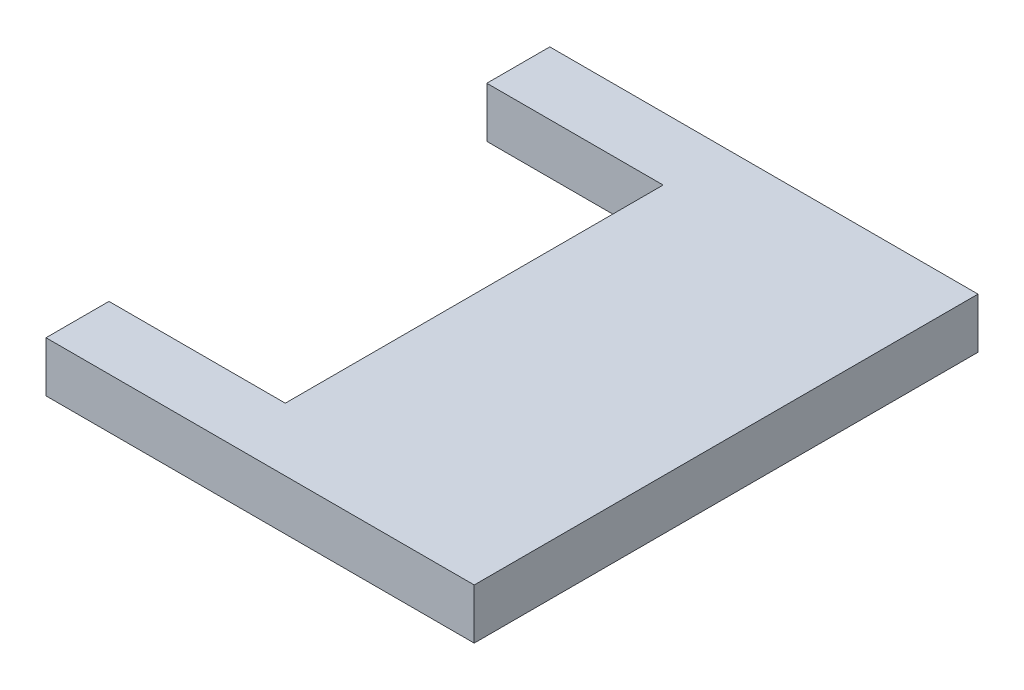
ISO-10303-21;
HEADER;
FILE_DESCRIPTION(('STEP AP214'),'2;1');
FILE_NAME('part.step','',(''),(''),'','','');
FILE_SCHEMA(('AUTOMOTIVE_DESIGN { 1 0 10303 214 1 1 1 1 }'));
ENDSEC;
DATA;
#1=APPLICATION_CONTEXT('core data for automotive mechanical design processes');
#2=APPLICATION_PROTOCOL_DEFINITION('international standard','automotive_design',2000,#1);
#3=PRODUCT_CONTEXT('',#1,'mechanical');
#4=PRODUCT('Part','Part','',(#3));
#5=PRODUCT_RELATED_PRODUCT_CATEGORY('part','',(#4));
#6=PRODUCT_DEFINITION_FORMATION('','',#4);
#7=PRODUCT_DEFINITION_CONTEXT('part definition',#1,'design');
#8=PRODUCT_DEFINITION('design','',#6,#7);
#9=PRODUCT_DEFINITION_SHAPE('','',#8);
#10=(LENGTH_UNIT() NAMED_UNIT(*) SI_UNIT(.MILLI.,.METRE.));
#11=(NAMED_UNIT(*) PLANE_ANGLE_UNIT() SI_UNIT($,.RADIAN.));
#12=(NAMED_UNIT(*) SI_UNIT($,.STERADIAN.) SOLID_ANGLE_UNIT());
#13=UNCERTAINTY_MEASURE_WITH_UNIT(LENGTH_MEASURE(1.E-05),#10,'distance_accuracy_value','');
#14=(GEOMETRIC_REPRESENTATION_CONTEXT(3) GLOBAL_UNCERTAINTY_ASSIGNED_CONTEXT((#13)) GLOBAL_UNIT_ASSIGNED_CONTEXT((#10,
#11,#12)) REPRESENTATION_CONTEXT('',''));
#15=CARTESIAN_POINT('',(0.,0.,0.));
#16=DIRECTION('',(0.,0.,1.));
#17=DIRECTION('',(1.,0.,0.));
#18=AXIS2_PLACEMENT_3D('',#15,#16,#17);
#19=CARTESIAN_POINT('',(0.,2.,0.));
#20=DIRECTION('',(0.,1.,0.));
#21=DIRECTION('',(0.,0.,1.));
#22=AXIS2_PLACEMENT_3D('',#19,#20,#21);
#23=PLANE('',#22);
#24=DIRECTION('',(0.,0.,-1.));
#25=VECTOR('',#24,1.);
#26=CARTESIAN_POINT('',(-2.,2.,-9.99999999999999));
#27=LINE('',#26,#25);
#28=CARTESIAN_POINT('',(-2.,2.,-7.49999999999999));
#29=VERTEX_POINT('',#28);
#30=CARTESIAN_POINT('',(-2.,2.,-9.99999999999999));
#31=VERTEX_POINT('',#30);
#32=EDGE_CURVE('E113',#29,#31,#27,.T.);
#33=ORIENTED_EDGE('',*,*,#32,.F.);
#34=DIRECTION('',(-1.,0.,0.));
#35=VECTOR('',#34,1.);
#36=CARTESIAN_POINT('',(-2.,2.,-7.49999999999999));
#37=LINE('',#36,#35);
#38=CARTESIAN_POINT('',(5.,2.,-7.49999999999999));
#39=VERTEX_POINT('',#38);
#40=EDGE_CURVE('E164',#39,#29,#37,.T.);
#41=ORIENTED_EDGE('',*,*,#40,.F.);
#42=DIRECTION('',(0.,0.,-1.));
#43=VECTOR('',#42,1.);
#44=CARTESIAN_POINT('',(5.,2.,7.50000000000001));
#45=LINE('',#44,#43);
#46=CARTESIAN_POINT('',(5.,2.,7.50000000000001));
#47=VERTEX_POINT('',#46);
#48=EDGE_CURVE('E174',#47,#39,#45,.T.);
#49=ORIENTED_EDGE('',*,*,#48,.F.);
#50=DIRECTION('',(1.,0.,0.));
#51=VECTOR('',#50,1.);
#52=CARTESIAN_POINT('',(-2.,2.,7.50000000000001));
#53=LINE('',#52,#51);
#54=CARTESIAN_POINT('',(-2.,2.,7.50000000000001));
#55=VERTEX_POINT('',#54);
#56=EDGE_CURVE('E118',#55,#47,#53,.T.);
#57=ORIENTED_EDGE('',*,*,#56,.F.);
#58=DIRECTION('',(0.,0.,-1.));
#59=VECTOR('',#58,1.);
#60=CARTESIAN_POINT('',(-2.,2.,3.18987050786824));
#61=LINE('',#60,#59);
#62=CARTESIAN_POINT('',(-2.,2.,10.));
#63=VERTEX_POINT('',#62);
#64=EDGE_CURVE('E106',#63,#55,#61,.T.);
#65=ORIENTED_EDGE('',*,*,#64,.F.);
#66=DIRECTION('',(1.,0.,0.));
#67=VECTOR('',#66,1.);
#68=CARTESIAN_POINT('',(-4.,2.,10.));
#69=LINE('',#68,#67);
#70=CARTESIAN_POINT('',(15.,2.,10.));
#71=VERTEX_POINT('',#70);
#72=EDGE_CURVE('E50',#63,#71,#69,.T.);
#73=ORIENTED_EDGE('',*,*,#72,.T.);
#74=DIRECTION('',(0.,0.,-1.));
#75=VECTOR('',#74,1.);
#76=CARTESIAN_POINT('',(15.,2.,-9.99999999999999));
#77=LINE('',#76,#75);
#78=CARTESIAN_POINT('',(15.,2.,-9.99999999999999));
#79=VERTEX_POINT('',#78);
#80=EDGE_CURVE('E128',#71,#79,#77,.T.);
#81=ORIENTED_EDGE('',*,*,#80,.T.);
#82=DIRECTION('',(-1.,0.,0.));
#83=VECTOR('',#82,1.);
#84=CARTESIAN_POINT('',(-4.,2.,-9.99999999999999));
#85=LINE('',#84,#83);
#86=EDGE_CURVE('E124',#79,#31,#85,.T.);
#87=ORIENTED_EDGE('',*,*,#86,.T.);
#88=EDGE_LOOP('',(#33,#41,#49,#57,#65,#73,#81,#87));
#89=FACE_BOUND('',#88,.T.);
#90=ADVANCED_FACE('F33',(#89),#23,.T.);
#91=CARTESIAN_POINT('',(0.,0.,0.));
#92=DIRECTION('',(0.,1.,0.));
#93=DIRECTION('',(0.,0.,1.));
#94=AXIS2_PLACEMENT_3D('',#91,#92,#93);
#95=PLANE('',#94);
#96=DIRECTION('',(-1.,0.,0.));
#97=VECTOR('',#96,1.);
#98=CARTESIAN_POINT('',(-2.,0.,-7.49999999999999));
#99=LINE('',#98,#97);
#100=CARTESIAN_POINT('',(5.,0.,-7.49999999999999));
#101=VERTEX_POINT('',#100);
#102=CARTESIAN_POINT('',(-2.,0.,-7.49999999999999));
#103=VERTEX_POINT('',#102);
#104=EDGE_CURVE('E163',#101,#103,#99,.T.);
#105=ORIENTED_EDGE('',*,*,#104,.T.);
#106=DIRECTION('',(0.,0.,-1.));
#107=VECTOR('',#106,1.);
#108=CARTESIAN_POINT('',(-2.,0.,0.));
#109=LINE('',#108,#107);
#110=CARTESIAN_POINT('',(-2.,0.,-9.99999999999999));
#111=VERTEX_POINT('',#110);
#112=EDGE_CURVE('E70',#103,#111,#109,.T.);
#113=ORIENTED_EDGE('',*,*,#112,.T.);
#114=DIRECTION('',(-1.,0.,0.));
#115=VECTOR('',#114,1.);
#116=CARTESIAN_POINT('',(-4.,0.,-9.99999999999999));
#117=LINE('',#116,#115);
#118=CARTESIAN_POINT('',(15.,0.,-9.99999999999999));
#119=VERTEX_POINT('',#118);
#120=EDGE_CURVE('E62',#119,#111,#117,.T.);
#121=ORIENTED_EDGE('',*,*,#120,.F.);
#122=DIRECTION('',(0.,0.,-1.));
#123=VECTOR('',#122,1.);
#124=CARTESIAN_POINT('',(15.,0.,-9.99999999999999));
#125=LINE('',#124,#123);
#126=CARTESIAN_POINT('',(15.,0.,10.));
#127=VERTEX_POINT('',#126);
#128=EDGE_CURVE('E132',#127,#119,#125,.T.);
#129=ORIENTED_EDGE('',*,*,#128,.F.);
#130=DIRECTION('',(1.,0.,0.));
#131=VECTOR('',#130,1.);
#132=CARTESIAN_POINT('',(-4.,0.,10.));
#133=LINE('',#132,#131);
#134=CARTESIAN_POINT('',(-2.,0.,10.));
#135=VERTEX_POINT('',#134);
#136=EDGE_CURVE('E137',#135,#127,#133,.T.);
#137=ORIENTED_EDGE('',*,*,#136,.F.);
#138=DIRECTION('',(0.,0.,-1.));
#139=VECTOR('',#138,1.);
#140=CARTESIAN_POINT('',(-2.,0.,0.));
#141=LINE('',#140,#139);
#142=CARTESIAN_POINT('',(-2.,0.,7.50000000000001));
#143=VERTEX_POINT('',#142);
#144=EDGE_CURVE('E109',#135,#143,#141,.T.);
#145=ORIENTED_EDGE('',*,*,#144,.T.);
#146=DIRECTION('',(1.,0.,0.));
#147=VECTOR('',#146,1.);
#148=CARTESIAN_POINT('',(-2.,0.,7.50000000000001));
#149=LINE('',#148,#147);
#150=CARTESIAN_POINT('',(5.,0.,7.50000000000001));
#151=VERTEX_POINT('',#150);
#152=EDGE_CURVE('E146',#143,#151,#149,.T.);
#153=ORIENTED_EDGE('',*,*,#152,.T.);
#154=DIRECTION('',(0.,0.,-1.));
#155=VECTOR('',#154,1.);
#156=CARTESIAN_POINT('',(5.,0.,0.));
#157=LINE('',#156,#155);
#158=EDGE_CURVE('E11',#151,#101,#157,.T.);
#159=ORIENTED_EDGE('',*,*,#158,.T.);
#160=EDGE_LOOP('',(#105,#113,#121,#129,#137,#145,#153,#159));
#161=FACE_BOUND('',#160,.T.);
#162=ADVANCED_FACE('F144',(#161),#95,.F.);
#163=CARTESIAN_POINT('',(15.,2.,-9.99999999999999));
#164=DIRECTION('',(-1.,0.,0.));
#165=DIRECTION('',(0.,0.,1.));
#166=AXIS2_PLACEMENT_3D('',#163,#164,#165);
#167=PLANE('',#166);
#168=ORIENTED_EDGE('',*,*,#128,.T.);
#169=DIRECTION('',(0.,-1.,0.));
#170=VECTOR('',#169,1.);
#171=CARTESIAN_POINT('',(15.,2.,-9.99999999999999));
#172=LINE('',#171,#170);
#173=EDGE_CURVE('E42',#79,#119,#172,.T.);
#174=ORIENTED_EDGE('',*,*,#173,.F.);
#175=ORIENTED_EDGE('',*,*,#80,.F.);
#176=DIRECTION('',(0.,-1.,0.));
#177=VECTOR('',#176,1.);
#178=CARTESIAN_POINT('',(15.,2.,10.));
#179=LINE('',#178,#177);
#180=EDGE_CURVE('E122',#71,#127,#179,.T.);
#181=ORIENTED_EDGE('',*,*,#180,.T.);
#182=EDGE_LOOP('',(#168,#174,#175,#181));
#183=FACE_BOUND('',#182,.T.);
#184=ADVANCED_FACE('F35',(#183),#167,.F.);
#185=CARTESIAN_POINT('',(-4.,2.,-9.99999999999999));
#186=DIRECTION('',(0.,0.,1.));
#187=DIRECTION('',(1.,0.,0.));
#188=AXIS2_PLACEMENT_3D('',#185,#186,#187);
#189=PLANE('',#188);
#190=ORIENTED_EDGE('',*,*,#120,.T.);
#191=DIRECTION('',(0.,1.,0.));
#192=VECTOR('',#191,1.);
#193=CARTESIAN_POINT('',(-2.,-8.,-9.99999999999999));
#194=LINE('',#193,#192);
#195=EDGE_CURVE('E112',#111,#31,#194,.T.);
#196=ORIENTED_EDGE('',*,*,#195,.T.);
#197=ORIENTED_EDGE('',*,*,#86,.F.);
#198=ORIENTED_EDGE('',*,*,#173,.T.);
#199=EDGE_LOOP('',(#190,#196,#197,#198));
#200=FACE_BOUND('',#199,.T.);
#201=ADVANCED_FACE('F140',(#200),#189,.F.);
#202=CARTESIAN_POINT('',(-4.,2.,10.));
#203=DIRECTION('',(0.,0.,-1.));
#204=DIRECTION('',(-1.,0.,0.));
#205=AXIS2_PLACEMENT_3D('',#202,#203,#204);
#206=PLANE('',#205);
#207=ORIENTED_EDGE('',*,*,#72,.F.);
#208=DIRECTION('',(0.,1.,0.));
#209=VECTOR('',#208,1.);
#210=CARTESIAN_POINT('',(-2.,-8.,10.));
#211=LINE('',#210,#209);
#212=EDGE_CURVE('E104',#135,#63,#211,.T.);
#213=ORIENTED_EDGE('',*,*,#212,.F.);
#214=ORIENTED_EDGE('',*,*,#136,.T.);
#215=ORIENTED_EDGE('',*,*,#180,.F.);
#216=EDGE_LOOP('',(#207,#213,#214,#215));
#217=FACE_BOUND('',#216,.T.);
#218=ADVANCED_FACE('F120',(#217),#206,.F.);
#219=CARTESIAN_POINT('',(-2.,2.,-7.49999999999999));
#220=DIRECTION('',(0.,0.,1.));
#221=DIRECTION('',(1.,0.,0.));
#222=AXIS2_PLACEMENT_3D('',#219,#220,#221);
#223=PLANE('',#222);
#224=ORIENTED_EDGE('',*,*,#104,.F.);
#225=DIRECTION('',(0.,1.,0.));
#226=VECTOR('',#225,1.);
#227=CARTESIAN_POINT('',(5.,-8.,-7.49999999999999));
#228=LINE('',#227,#226);
#229=EDGE_CURVE('E155',#101,#39,#228,.T.);
#230=ORIENTED_EDGE('',*,*,#229,.T.);
#231=ORIENTED_EDGE('',*,*,#40,.T.);
#232=DIRECTION('',(0.,-1.,0.));
#233=VECTOR('',#232,1.);
#234=CARTESIAN_POINT('',(-2.,2.,-7.49999999999999));
#235=LINE('',#234,#233);
#236=EDGE_CURVE('E135',#29,#103,#235,.T.);
#237=ORIENTED_EDGE('',*,*,#236,.T.);
#238=EDGE_LOOP('',(#224,#230,#231,#237));
#239=FACE_BOUND('',#238,.T.);
#240=ADVANCED_FACE('F170',(#239),#223,.T.);
#241=CARTESIAN_POINT('',(-2.,2.,7.50000000000001));
#242=DIRECTION('',(0.,0.,-1.));
#243=DIRECTION('',(-1.,0.,0.));
#244=AXIS2_PLACEMENT_3D('',#241,#242,#243);
#245=PLANE('',#244);
#246=ORIENTED_EDGE('',*,*,#152,.F.);
#247=DIRECTION('',(0.,-1.,0.));
#248=VECTOR('',#247,1.);
#249=CARTESIAN_POINT('',(-2.,2.,7.50000000000001));
#250=LINE('',#249,#248);
#251=EDGE_CURVE('E152',#55,#143,#250,.T.);
#252=ORIENTED_EDGE('',*,*,#251,.F.);
#253=ORIENTED_EDGE('',*,*,#56,.T.);
#254=DIRECTION('',(0.,1.,0.));
#255=VECTOR('',#254,1.);
#256=CARTESIAN_POINT('',(5.,-8.,7.50000000000001));
#257=LINE('',#256,#255);
#258=EDGE_CURVE('E154',#151,#47,#257,.T.);
#259=ORIENTED_EDGE('',*,*,#258,.F.);
#260=EDGE_LOOP('',(#246,#252,#253,#259));
#261=FACE_BOUND('',#260,.T.);
#262=ADVANCED_FACE('F151',(#261),#245,.T.);
#263=CARTESIAN_POINT('',(5.,-8.,7.50000000000001));
#264=DIRECTION('',(1.,0.,0.));
#265=DIRECTION('',(0.,0.,-1.));
#266=AXIS2_PLACEMENT_3D('',#263,#264,#265);
#267=PLANE('',#266);
#268=ORIENTED_EDGE('',*,*,#258,.T.);
#269=ORIENTED_EDGE('',*,*,#48,.T.);
#270=ORIENTED_EDGE('',*,*,#229,.F.);
#271=ORIENTED_EDGE('',*,*,#158,.F.);
#272=EDGE_LOOP('',(#268,#269,#270,#271));
#273=FACE_BOUND('',#272,.T.);
#274=ADVANCED_FACE('F175',(#273),#267,.F.);
#275=CARTESIAN_POINT('',(-2.,-8.,3.18987050786824));
#276=DIRECTION('',(1.,0.,0.));
#277=DIRECTION('',(0.,0.,-1.));
#278=AXIS2_PLACEMENT_3D('',#275,#276,#277);
#279=PLANE('',#278);
#280=ORIENTED_EDGE('',*,*,#212,.T.);
#281=ORIENTED_EDGE('',*,*,#64,.T.);
#282=ORIENTED_EDGE('',*,*,#251,.T.);
#283=ORIENTED_EDGE('',*,*,#144,.F.);
#284=EDGE_LOOP('',(#280,#281,#282,#283));
#285=FACE_BOUND('',#284,.T.);
#286=ADVANCED_FACE('F105',(#285),#279,.F.);
#287=CARTESIAN_POINT('',(-2.,-8.,-9.99999999999999));
#288=DIRECTION('',(1.,0.,0.));
#289=DIRECTION('',(0.,0.,-1.));
#290=AXIS2_PLACEMENT_3D('',#287,#288,#289);
#291=PLANE('',#290);
#292=ORIENTED_EDGE('',*,*,#236,.F.);
#293=ORIENTED_EDGE('',*,*,#32,.T.);
#294=ORIENTED_EDGE('',*,*,#195,.F.);
#295=ORIENTED_EDGE('',*,*,#112,.F.);
#296=EDGE_LOOP('',(#292,#293,#294,#295));
#297=FACE_BOUND('',#296,.T.);
#298=ADVANCED_FACE('F179',(#297),#291,.F.);
#299=CLOSED_SHELL('',(#90,#162,#184,#201,#218,#240,#262,#274,#286,#298));
#300=MANIFOLD_SOLID_BREP('B2',#299);
#301=ADVANCED_BREP_SHAPE_REPRESENTATION('',(#18,#300),#14);
#302=SHAPE_DEFINITION_REPRESENTATION(#9,#301);
ENDSEC;
END-ISO-10303-21;
